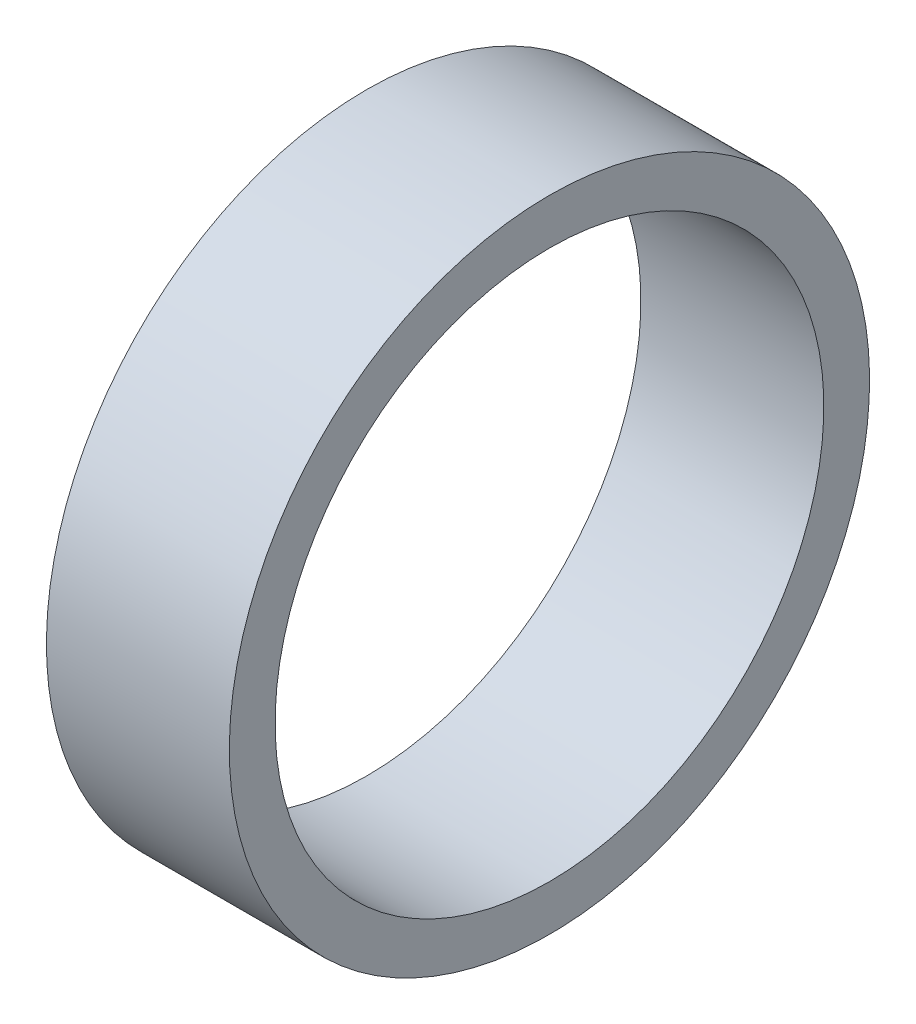
ISO-10303-21;
HEADER;
FILE_DESCRIPTION(('STEP AP214'),'2;1');
FILE_NAME('part.step','',(''),(''),'','','');
FILE_SCHEMA(('AUTOMOTIVE_DESIGN { 1 0 10303 214 1 1 1 1 }'));
ENDSEC;
DATA;
#1=APPLICATION_CONTEXT('core data for automotive mechanical design processes');
#2=APPLICATION_PROTOCOL_DEFINITION('international standard','automotive_design',2000,#1);
#3=PRODUCT_CONTEXT('',#1,'mechanical');
#4=PRODUCT('Part','Part','',(#3));
#5=PRODUCT_RELATED_PRODUCT_CATEGORY('part','',(#4));
#6=PRODUCT_DEFINITION_FORMATION('','',#4);
#7=PRODUCT_DEFINITION_CONTEXT('part definition',#1,'design');
#8=PRODUCT_DEFINITION('design','',#6,#7);
#9=PRODUCT_DEFINITION_SHAPE('','',#8);
#10=(LENGTH_UNIT() NAMED_UNIT(*) SI_UNIT(.MILLI.,.METRE.));
#11=(NAMED_UNIT(*) PLANE_ANGLE_UNIT() SI_UNIT($,.RADIAN.));
#12=(NAMED_UNIT(*) SI_UNIT($,.STERADIAN.) SOLID_ANGLE_UNIT());
#13=UNCERTAINTY_MEASURE_WITH_UNIT(LENGTH_MEASURE(1.E-05),#10,'distance_accuracy_value','');
#14=(GEOMETRIC_REPRESENTATION_CONTEXT(3) GLOBAL_UNCERTAINTY_ASSIGNED_CONTEXT((#13)) GLOBAL_UNIT_ASSIGNED_CONTEXT((#10,
#11,#12)) REPRESENTATION_CONTEXT('',''));
#15=CARTESIAN_POINT('',(0.,0.,0.));
#16=DIRECTION('',(0.,0.,1.));
#17=DIRECTION('',(1.,0.,0.));
#18=AXIS2_PLACEMENT_3D('',#15,#16,#17);
#19=CARTESIAN_POINT('',(0.,0.,0.));
#20=DIRECTION('',(-1.,0.,0.));
#21=DIRECTION('',(0.,0.,1.));
#22=AXIS2_PLACEMENT_3D('',#19,#20,#21);
#23=CYLINDRICAL_SURFACE('',#22,120.);
#24=CARTESIAN_POINT('',(1100.,0.,0.));
#25=DIRECTION('',(-1.,0.,0.));
#26=DIRECTION('',(0.,0.,1.));
#27=AXIS2_PLACEMENT_3D('',#24,#25,#26);
#28=CIRCLE('',#27,120.);
#29=CARTESIAN_POINT('',(1100.,120.,-8.61550327161987E-07));
#30=VERTEX_POINT('',#29);
#31=CARTESIAN_POINT('',(1100.,120.,0.));
#32=VERTEX_POINT('',#31);
#33=EDGE_CURVE('E11',#30,#32,#28,.T.);
#34=ORIENTED_EDGE('',*,*,#33,.T.);
#35=DIRECTION('',(1.,0.,0.));
#36=VECTOR('',#35,1.);
#37=CARTESIAN_POINT('',(1180.,120.,0.));
#38=LINE('',#37,#36);
#39=CARTESIAN_POINT('',(1180.,120.,0.));
#40=VERTEX_POINT('',#39);
#41=EDGE_CURVE('E100',#32,#40,#38,.T.);
#42=ORIENTED_EDGE('',*,*,#41,.T.);
#43=CARTESIAN_POINT('',(1180.,0.,0.));
#44=DIRECTION('',(-1.,0.,0.));
#45=DIRECTION('',(0.,0.,1.));
#46=AXIS2_PLACEMENT_3D('',#43,#44,#45);
#47=CIRCLE('',#46,120.);
#48=CARTESIAN_POINT('',(1180.,120.,-8.61550327161987E-07));
#49=VERTEX_POINT('',#48);
#50=EDGE_CURVE('E80',#49,#40,#47,.T.);
#51=ORIENTED_EDGE('',*,*,#50,.F.);
#52=DIRECTION('',(1.,0.,0.));
#53=VECTOR('',#52,1.);
#54=CARTESIAN_POINT('',(1180.,120.,-8.61550327161987E-07));
#55=LINE('',#54,#53);
#56=EDGE_CURVE('E103',#30,#49,#55,.T.);
#57=ORIENTED_EDGE('',*,*,#56,.F.);
#58=EDGE_LOOP('',(#34,#42,#51,#57));
#59=FACE_BOUND('',#58,.T.);
#60=ADVANCED_FACE('F39',(#59),#23,.F.);
#61=CARTESIAN_POINT('',(1100.,120.,-8.61550327161987E-07));
#62=DIRECTION('',(1.,0.,0.));
#63=DIRECTION('',(0.,0.,-1.));
#64=AXIS2_PLACEMENT_3D('',#61,#62,#63);
#65=PLANE('',#64);
#66=CARTESIAN_POINT('',(1100.,0.,0.));
#67=DIRECTION('',(-1.,0.,0.));
#68=DIRECTION('',(0.,0.,1.));
#69=AXIS2_PLACEMENT_3D('',#66,#67,#68);
#70=CIRCLE('',#69,140.);
#71=CARTESIAN_POINT('',(1100.,140.,-1.00514204835565E-06));
#72=VERTEX_POINT('',#71);
#73=CARTESIAN_POINT('',(1100.,140.,0.));
#74=VERTEX_POINT('',#73);
#75=EDGE_CURVE('E50',#72,#74,#70,.T.);
#76=ORIENTED_EDGE('',*,*,#75,.T.);
#77=DIRECTION('',(0.,-1.,0.));
#78=VECTOR('',#77,1.);
#79=CARTESIAN_POINT('',(1100.,120.,0.));
#80=LINE('',#79,#78);
#81=EDGE_CURVE('E104',#74,#32,#80,.T.);
#82=ORIENTED_EDGE('',*,*,#81,.T.);
#83=ORIENTED_EDGE('',*,*,#33,.F.);
#84=DIRECTION('',(0.,-1.,7.17958605968322E-09));
#85=VECTOR('',#84,1.);
#86=CARTESIAN_POINT('',(1100.,120.,-8.61550327161987E-07));
#87=LINE('',#86,#85);
#88=EDGE_CURVE('E91',#72,#30,#87,.T.);
#89=ORIENTED_EDGE('',*,*,#88,.F.);
#90=EDGE_LOOP('',(#76,#82,#83,#89));
#91=FACE_BOUND('',#90,.T.);
#92=ADVANCED_FACE('F41',(#91),#65,.F.);
#93=CARTESIAN_POINT('',(0.,0.,0.));
#94=DIRECTION('',(-1.,0.,0.));
#95=DIRECTION('',(0.,0.,1.));
#96=AXIS2_PLACEMENT_3D('',#93,#94,#95);
#97=CYLINDRICAL_SURFACE('',#96,140.);
#98=CARTESIAN_POINT('',(1180.,0.,0.));
#99=DIRECTION('',(-1.,0.,0.));
#100=DIRECTION('',(0.,0.,1.));
#101=AXIS2_PLACEMENT_3D('',#98,#99,#100);
#102=CIRCLE('',#101,140.);
#103=CARTESIAN_POINT('',(1180.,140.,-1.00514204835565E-06));
#104=VERTEX_POINT('',#103);
#105=CARTESIAN_POINT('',(1180.,140.,0.));
#106=VERTEX_POINT('',#105);
#107=EDGE_CURVE('E89',#104,#106,#102,.T.);
#108=ORIENTED_EDGE('',*,*,#107,.T.);
#109=DIRECTION('',(-1.,0.,0.));
#110=VECTOR('',#109,1.);
#111=CARTESIAN_POINT('',(1100.,140.,0.));
#112=LINE('',#111,#110);
#113=EDGE_CURVE('E97',#106,#74,#112,.T.);
#114=ORIENTED_EDGE('',*,*,#113,.T.);
#115=ORIENTED_EDGE('',*,*,#75,.F.);
#116=DIRECTION('',(-1.,0.,0.));
#117=VECTOR('',#116,1.);
#118=CARTESIAN_POINT('',(1100.,140.,-1.00514204835565E-06));
#119=LINE('',#118,#117);
#120=EDGE_CURVE('E109',#104,#72,#119,.T.);
#121=ORIENTED_EDGE('',*,*,#120,.F.);
#122=EDGE_LOOP('',(#108,#114,#115,#121));
#123=FACE_BOUND('',#122,.T.);
#124=ADVANCED_FACE('F112',(#123),#97,.T.);
#125=CARTESIAN_POINT('',(1180.,140.,-1.00514204835565E-06));
#126=DIRECTION('',(-1.,0.,0.));
#127=DIRECTION('',(0.,0.,1.));
#128=AXIS2_PLACEMENT_3D('',#125,#126,#127);
#129=PLANE('',#128);
#130=DIRECTION('',(0.,1.,-7.17958605968322E-09));
#131=VECTOR('',#130,1.);
#132=CARTESIAN_POINT('',(1180.,140.,-1.00514204835565E-06));
#133=LINE('',#132,#131);
#134=EDGE_CURVE('E82',#49,#104,#133,.T.);
#135=ORIENTED_EDGE('',*,*,#134,.F.);
#136=ORIENTED_EDGE('',*,*,#50,.T.);
#137=DIRECTION('',(0.,1.,0.));
#138=VECTOR('',#137,1.);
#139=CARTESIAN_POINT('',(1180.,140.,0.));
#140=LINE('',#139,#138);
#141=EDGE_CURVE('E85',#40,#106,#140,.T.);
#142=ORIENTED_EDGE('',*,*,#141,.T.);
#143=ORIENTED_EDGE('',*,*,#107,.F.);
#144=EDGE_LOOP('',(#135,#136,#142,#143));
#145=FACE_BOUND('',#144,.T.);
#146=ADVANCED_FACE('F83',(#145),#129,.F.);
#147=CARTESIAN_POINT('',(0.,0.,0.));
#148=DIRECTION('',(0.,-7.17958605968322E-09,-1.));
#149=DIRECTION('',(-1.,0.,0.));
#150=AXIS2_PLACEMENT_3D('',#147,#148,#149);
#151=PLANE('',#150);
#152=ORIENTED_EDGE('',*,*,#56,.T.);
#153=ORIENTED_EDGE('',*,*,#134,.T.);
#154=ORIENTED_EDGE('',*,*,#120,.T.);
#155=ORIENTED_EDGE('',*,*,#88,.T.);
#156=EDGE_LOOP('',(#152,#153,#154,#155));
#157=FACE_BOUND('',#156,.T.);
#158=ADVANCED_FACE('F111',(#157),#151,.F.);
#159=CARTESIAN_POINT('',(0.,0.,0.));
#160=DIRECTION('',(0.,0.,-1.));
#161=DIRECTION('',(-1.,0.,0.));
#162=AXIS2_PLACEMENT_3D('',#159,#160,#161);
#163=PLANE('',#162);
#164=ORIENTED_EDGE('',*,*,#41,.F.);
#165=ORIENTED_EDGE('',*,*,#81,.F.);
#166=ORIENTED_EDGE('',*,*,#113,.F.);
#167=ORIENTED_EDGE('',*,*,#141,.F.);
#168=EDGE_LOOP('',(#164,#165,#166,#167));
#169=FACE_BOUND('',#168,.T.);
#170=ADVANCED_FACE('F94',(#169),#163,.T.);
#171=CLOSED_SHELL('',(#60,#92,#124,#146,#158,#170));
#172=MANIFOLD_SOLID_BREP('B2',#171);
#173=ADVANCED_BREP_SHAPE_REPRESENTATION('',(#18,#172),#14);
#174=SHAPE_DEFINITION_REPRESENTATION(#9,#173);
ENDSEC;
END-ISO-10303-21;
